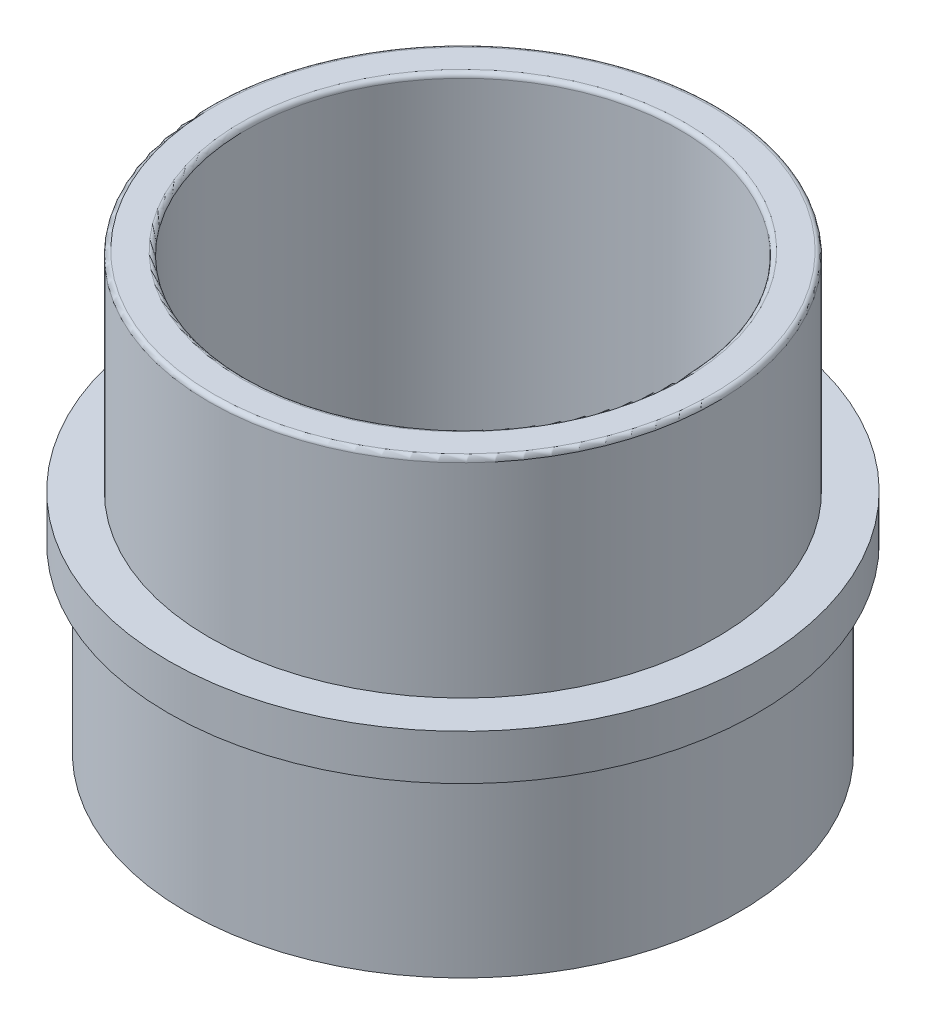
ISO-10303-21;
HEADER;
FILE_DESCRIPTION(('STEP AP214'),'2;1');
FILE_NAME('part.step','',(''),(''),'','','');
FILE_SCHEMA(('AUTOMOTIVE_DESIGN { 1 0 10303 214 1 1 1 1 }'));
ENDSEC;
DATA;
#1=APPLICATION_CONTEXT('core data for automotive mechanical design processes');
#2=APPLICATION_PROTOCOL_DEFINITION('international standard','automotive_design',2000,#1);
#3=PRODUCT_CONTEXT('',#1,'mechanical');
#4=PRODUCT('Part','Part','',(#3));
#5=PRODUCT_RELATED_PRODUCT_CATEGORY('part','',(#4));
#6=PRODUCT_DEFINITION_FORMATION('','',#4);
#7=PRODUCT_DEFINITION_CONTEXT('part definition',#1,'design');
#8=PRODUCT_DEFINITION('design','',#6,#7);
#9=PRODUCT_DEFINITION_SHAPE('','',#8);
#10=(LENGTH_UNIT() NAMED_UNIT(*) SI_UNIT(.MILLI.,.METRE.));
#11=(NAMED_UNIT(*) PLANE_ANGLE_UNIT() SI_UNIT($,.RADIAN.));
#12=(NAMED_UNIT(*) SI_UNIT($,.STERADIAN.) SOLID_ANGLE_UNIT());
#13=UNCERTAINTY_MEASURE_WITH_UNIT(LENGTH_MEASURE(1.E-05),#10,'distance_accuracy_value','');
#14=(GEOMETRIC_REPRESENTATION_CONTEXT(3) GLOBAL_UNCERTAINTY_ASSIGNED_CONTEXT((#13)) GLOBAL_UNIT_ASSIGNED_CONTEXT((#10,
#11,#12)) REPRESENTATION_CONTEXT('',''));
#15=CARTESIAN_POINT('',(0.,0.,0.));
#16=DIRECTION('',(0.,0.,1.));
#17=DIRECTION('',(1.,0.,0.));
#18=AXIS2_PLACEMENT_3D('',#15,#16,#17);
#19=CARTESIAN_POINT('',(0.,5.,0.));
#20=DIRECTION('',(0.,1.,0.));
#21=DIRECTION('',(0.,0.,1.));
#22=AXIS2_PLACEMENT_3D('',#19,#20,#21);
#23=PLANE('',#22);
#24=CARTESIAN_POINT('',(0.,5.,0.));
#25=DIRECTION('',(0.,1.,0.));
#26=DIRECTION('',(0.,0.,1.));
#27=AXIS2_PLACEMENT_3D('',#24,#25,#26);
#28=CIRCLE('',#27,32.5);
#29=CARTESIAN_POINT('',(0.,5.,32.5));
#30=VERTEX_POINT('',#29);
#31=EDGE_CURVE('E62',#30,#30,#28,.T.);
#32=ORIENTED_EDGE('',*,*,#31,.T.);
#33=EDGE_LOOP('',(#32));
#34=FACE_BOUND('',#33,.T.);
#35=CARTESIAN_POINT('',(0.,5.,0.));
#36=DIRECTION('',(0.,1.,0.));
#37=DIRECTION('',(0.,0.,1.));
#38=AXIS2_PLACEMENT_3D('',#35,#36,#37);
#39=CIRCLE('',#38,28.);
#40=CARTESIAN_POINT('',(0.,5.,28.));
#41=VERTEX_POINT('',#40);
#42=EDGE_CURVE('E74',#41,#41,#39,.T.);
#43=ORIENTED_EDGE('',*,*,#42,.F.);
#44=EDGE_LOOP('',(#43));
#45=FACE_BOUND('',#44,.T.);
#46=ADVANCED_FACE('F30',(#34,#45),#23,.T.);
#47=CARTESIAN_POINT('',(0.,-20.,0.));
#48=DIRECTION('',(0.,-1.,0.));
#49=DIRECTION('',(0.,0.,-1.));
#50=AXIS2_PLACEMENT_3D('',#47,#48,#49);
#51=PLANE('',#50);
#52=CARTESIAN_POINT('',(0.,-20.,0.));
#53=DIRECTION('',(0.,-1.,0.));
#54=DIRECTION('',(0.,0.,-1.));
#55=AXIS2_PLACEMENT_3D('',#52,#53,#54);
#56=CIRCLE('',#55,29.3647017494803);
#57=CARTESIAN_POINT('',(0.,-20.,-29.3647017494803));
#58=VERTEX_POINT('',#57);
#59=EDGE_CURVE('E56',#58,#58,#56,.F.);
#60=ORIENTED_EDGE('',*,*,#59,.T.);
#61=EDGE_LOOP('',(#60));
#62=FACE_BOUND('',#61,.T.);
#63=CARTESIAN_POINT('',(0.,-20.,0.));
#64=DIRECTION('',(0.,-1.,0.));
#65=DIRECTION('',(0.,0.,-1.));
#66=AXIS2_PLACEMENT_3D('',#63,#64,#65);
#67=CIRCLE('',#66,30.5);
#68=CARTESIAN_POINT('',(0.,-20.,-30.5));
#69=VERTEX_POINT('',#68);
#70=EDGE_CURVE('E71',#69,#69,#67,.T.);
#71=ORIENTED_EDGE('',*,*,#70,.T.);
#72=EDGE_LOOP('',(#71));
#73=FACE_BOUND('',#72,.T.);
#74=ADVANCED_FACE('F81',(#62,#73),#51,.T.);
#75=CARTESIAN_POINT('',(0.,5.,0.));
#76=DIRECTION('',(0.,-1.,0.));
#77=DIRECTION('',(0.,0.,-1.));
#78=AXIS2_PLACEMENT_3D('',#75,#76,#77);
#79=CYLINDRICAL_SURFACE('',#78,32.5);
#80=ORIENTED_EDGE('',*,*,#31,.F.);
#81=EDGE_LOOP('',(#80));
#82=FACE_BOUND('',#81,.T.);
#83=CARTESIAN_POINT('',(0.,0.,0.));
#84=DIRECTION('',(0.,1.,0.));
#85=DIRECTION('',(0.,0.,1.));
#86=AXIS2_PLACEMENT_3D('',#83,#84,#85);
#87=CIRCLE('',#86,32.5);
#88=CARTESIAN_POINT('',(0.,0.,32.5));
#89=VERTEX_POINT('',#88);
#90=EDGE_CURVE('E63',#89,#89,#87,.T.);
#91=ORIENTED_EDGE('',*,*,#90,.T.);
#92=EDGE_LOOP('',(#91));
#93=FACE_BOUND('',#92,.T.);
#94=ADVANCED_FACE('F87',(#82,#93),#79,.T.);
#95=CARTESIAN_POINT('',(0.,0.,0.));
#96=DIRECTION('',(0.,1.,0.));
#97=DIRECTION('',(0.,0.,1.));
#98=AXIS2_PLACEMENT_3D('',#95,#96,#97);
#99=PLANE('',#98);
#100=CARTESIAN_POINT('',(0.,0.,0.));
#101=DIRECTION('',(0.,1.,0.));
#102=DIRECTION('',(0.,0.,1.));
#103=AXIS2_PLACEMENT_3D('',#100,#101,#102);
#104=CIRCLE('',#103,30.5);
#105=CARTESIAN_POINT('',(0.,0.,30.5));
#106=VERTEX_POINT('',#105);
#107=EDGE_CURVE('E66',#106,#106,#104,.F.);
#108=ORIENTED_EDGE('',*,*,#107,.F.);
#109=EDGE_LOOP('',(#108));
#110=FACE_BOUND('',#109,.T.);
#111=ORIENTED_EDGE('',*,*,#90,.F.);
#112=EDGE_LOOP('',(#111));
#113=FACE_BOUND('',#112,.T.);
#114=ADVANCED_FACE('F93',(#110,#113),#99,.F.);
#115=CARTESIAN_POINT('',(0.,86.2670273047588,0.));
#116=DIRECTION('',(0.,-1.,0.));
#117=DIRECTION('',(0.,0.,-1.));
#118=AXIS2_PLACEMENT_3D('',#115,#116,#117);
#119=CYLINDRICAL_SURFACE('',#118,30.5);
#120=ORIENTED_EDGE('',*,*,#107,.T.);
#121=EDGE_LOOP('',(#120));
#122=FACE_BOUND('',#121,.T.);
#123=ORIENTED_EDGE('',*,*,#70,.F.);
#124=EDGE_LOOP('',(#123));
#125=FACE_BOUND('',#124,.T.);
#126=ADVANCED_FACE('F92',(#122,#125),#119,.T.);
#127=CARTESIAN_POINT('',(0.,-10.,0.));
#128=DIRECTION('',(0.,-1.,0.));
#129=DIRECTION('',(0.,0.,-1.));
#130=AXIS2_PLACEMENT_3D('',#127,#128,#129);
#131=CONICAL_SURFACE('',#130,24.,0.20943951023932);
#132=CARTESIAN_POINT('',(0.,-11.233689466625,0.));
#133=DIRECTION('',(0.,-1.,0.));
#134=DIRECTION('',(0.,0.,-1.));
#135=AXIS2_PLACEMENT_3D('',#132,#133,#134);
#136=CIRCLE('',#135,24.2622287911943);
#137=CARTESIAN_POINT('',(0.,-11.233689466625,-24.2622287911943));
#138=VERTEX_POINT('',#137);
#139=EDGE_CURVE('E50',#138,#138,#136,.F.);
#140=ORIENTED_EDGE('',*,*,#139,.T.);
#141=EDGE_LOOP('',(#140));
#142=FACE_BOUND('',#141,.T.);
#143=CARTESIAN_POINT('',(0.,-16.831646763271,0.));
#144=DIRECTION('',(0.,1.,0.));
#145=DIRECTION('',(0.,0.,1.));
#146=AXIS2_PLACEMENT_3D('',#143,#144,#145);
#147=CIRCLE('',#146,25.452111346545);
#148=CARTESIAN_POINT('',(0.,-16.831646763271,25.452111346545));
#149=VERTEX_POINT('',#148);
#150=EDGE_CURVE('E59',#149,#149,#147,.F.);
#151=ORIENTED_EDGE('',*,*,#150,.T.);
#152=EDGE_LOOP('',(#151));
#153=FACE_BOUND('',#152,.T.);
#154=ADVANCED_FACE('F104',(#142,#153),#131,.F.);
#155=CARTESIAN_POINT('',(0.,-16.,0.));
#156=DIRECTION('',(0.,-1.,0.));
#157=DIRECTION('',(0.,0.,-1.));
#158=AXIS2_PLACEMENT_3D('',#155,#156,#157);
#159=TOROIDAL_SURFACE('',#158,29.3647017494803,4.);
#160=ORIENTED_EDGE('',*,*,#59,.F.);
#161=EDGE_LOOP('',(#160));
#162=FACE_BOUND('',#161,.T.);
#163=ORIENTED_EDGE('',*,*,#150,.F.);
#164=EDGE_LOOP('',(#163));
#165=FACE_BOUND('',#164,.T.);
#166=ADVANCED_FACE('F100',(#162,#165),#159,.T.);
#167=CARTESIAN_POINT('',(0.,5.,0.));
#168=DIRECTION('',(0.,-1.,0.));
#169=DIRECTION('',(0.,0.,-1.));
#170=AXIS2_PLACEMENT_3D('',#167,#168,#169);
#171=CYLINDRICAL_SURFACE('',#170,24.);
#172=CARTESIAN_POINT('',(0.,27.5,0.));
#173=DIRECTION('',(0.,1.,0.));
#174=DIRECTION('',(0.,0.,1.));
#175=AXIS2_PLACEMENT_3D('',#172,#173,#174);
#176=CIRCLE('',#175,24.);
#177=CARTESIAN_POINT('',(0.,27.5,24.));
#178=VERTEX_POINT('',#177);
#179=EDGE_CURVE('E10',#178,#178,#176,.T.);
#180=ORIENTED_EDGE('',*,*,#179,.T.);
#181=EDGE_LOOP('',(#180));
#182=FACE_BOUND('',#181,.T.);
#183=CARTESIAN_POINT('',(0.,-8.73874917681188,0.));
#184=DIRECTION('',(0.,1.,0.));
#185=DIRECTION('',(0.,0.,1.));
#186=AXIS2_PLACEMENT_3D('',#183,#184,#185);
#187=CIRCLE('',#186,24.);
#188=CARTESIAN_POINT('',(0.,-8.73874917681188,24.));
#189=VERTEX_POINT('',#188);
#190=EDGE_CURVE('E53',#189,#189,#187,.F.);
#191=ORIENTED_EDGE('',*,*,#190,.T.);
#192=EDGE_LOOP('',(#191));
#193=FACE_BOUND('',#192,.T.);
#194=ADVANCED_FACE('F103',(#182,#193),#171,.F.);
#195=CARTESIAN_POINT('',(0.,-8.73874917681188,0.));
#196=DIRECTION('',(0.,1.,0.));
#197=DIRECTION('',(0.,0.,1.));
#198=AXIS2_PLACEMENT_3D('',#195,#196,#197);
#199=TOROIDAL_SURFACE('',#198,36.,12.);
#200=ORIENTED_EDGE('',*,*,#139,.F.);
#201=EDGE_LOOP('',(#200));
#202=FACE_BOUND('',#201,.T.);
#203=ORIENTED_EDGE('',*,*,#190,.F.);
#204=EDGE_LOOP('',(#203));
#205=FACE_BOUND('',#204,.T.);
#206=ADVANCED_FACE('F106',(#202,#205),#199,.T.);
#207=CARTESIAN_POINT('',(0.,28.,0.));
#208=DIRECTION('',(0.,1.,0.));
#209=DIRECTION('',(0.,0.,1.));
#210=AXIS2_PLACEMENT_3D('',#207,#208,#209);
#211=PLANE('',#210);
#212=CARTESIAN_POINT('',(0.,28.,0.));
#213=DIRECTION('',(0.,1.,0.));
#214=DIRECTION('',(0.,0.,1.));
#215=AXIS2_PLACEMENT_3D('',#212,#213,#214);
#216=CIRCLE('',#215,27.5);
#217=CARTESIAN_POINT('',(0.,28.,27.5));
#218=VERTEX_POINT('',#217);
#219=EDGE_CURVE('E41',#218,#218,#216,.T.);
#220=ORIENTED_EDGE('',*,*,#219,.T.);
#221=EDGE_LOOP('',(#220));
#222=FACE_BOUND('',#221,.T.);
#223=CARTESIAN_POINT('',(0.,28.,0.));
#224=DIRECTION('',(0.,1.,0.));
#225=DIRECTION('',(0.,0.,1.));
#226=AXIS2_PLACEMENT_3D('',#223,#224,#225);
#227=CIRCLE('',#226,24.5);
#228=CARTESIAN_POINT('',(0.,28.,24.5));
#229=VERTEX_POINT('',#228);
#230=EDGE_CURVE('E45',#229,#229,#227,.F.);
#231=ORIENTED_EDGE('',*,*,#230,.T.);
#232=EDGE_LOOP('',(#231));
#233=FACE_BOUND('',#232,.T.);
#234=ADVANCED_FACE('F108',(#222,#233),#211,.T.);
#235=CARTESIAN_POINT('',(0.,28.,0.));
#236=DIRECTION('',(0.,-1.,0.));
#237=DIRECTION('',(0.,0.,-1.));
#238=AXIS2_PLACEMENT_3D('',#235,#236,#237);
#239=CYLINDRICAL_SURFACE('',#238,28.);
#240=CARTESIAN_POINT('',(0.,27.5,0.));
#241=DIRECTION('',(0.,1.,0.));
#242=DIRECTION('',(0.,0.,1.));
#243=AXIS2_PLACEMENT_3D('',#240,#241,#242);
#244=CIRCLE('',#243,28.);
#245=CARTESIAN_POINT('',(0.,27.5,28.));
#246=VERTEX_POINT('',#245);
#247=EDGE_CURVE('E37',#246,#246,#244,.F.);
#248=ORIENTED_EDGE('',*,*,#247,.T.);
#249=EDGE_LOOP('',(#248));
#250=FACE_BOUND('',#249,.T.);
#251=ORIENTED_EDGE('',*,*,#42,.T.);
#252=EDGE_LOOP('',(#251));
#253=FACE_BOUND('',#252,.T.);
#254=ADVANCED_FACE('F78',(#250,#253),#239,.T.);
#255=CARTESIAN_POINT('',(0.,27.5,0.));
#256=DIRECTION('',(0.,1.,0.));
#257=DIRECTION('',(0.,0.,1.));
#258=AXIS2_PLACEMENT_3D('',#255,#256,#257);
#259=TOROIDAL_SURFACE('',#258,27.5,0.5);
#260=ORIENTED_EDGE('',*,*,#247,.F.);
#261=EDGE_LOOP('',(#260));
#262=FACE_BOUND('',#261,.T.);
#263=ORIENTED_EDGE('',*,*,#219,.F.);
#264=EDGE_LOOP('',(#263));
#265=FACE_BOUND('',#264,.T.);
#266=ADVANCED_FACE('F110',(#262,#265),#259,.T.);
#267=CARTESIAN_POINT('',(0.,27.5,0.));
#268=DIRECTION('',(0.,1.,0.));
#269=DIRECTION('',(0.,0.,1.));
#270=AXIS2_PLACEMENT_3D('',#267,#268,#269);
#271=TOROIDAL_SURFACE('',#270,24.5,0.5);
#272=ORIENTED_EDGE('',*,*,#230,.F.);
#273=EDGE_LOOP('',(#272));
#274=FACE_BOUND('',#273,.T.);
#275=ORIENTED_EDGE('',*,*,#179,.F.);
#276=EDGE_LOOP('',(#275));
#277=FACE_BOUND('',#276,.T.);
#278=ADVANCED_FACE('F32',(#274,#277),#271,.T.);
#279=CLOSED_SHELL('',(#46,#74,#94,#114,#126,#154,#166,#194,#206,#234,#254,#266,#278));
#280=MANIFOLD_SOLID_BREP('B2',#279);
#281=ADVANCED_BREP_SHAPE_REPRESENTATION('',(#18,#280),#14);
#282=SHAPE_DEFINITION_REPRESENTATION(#9,#281);
ENDSEC;
END-ISO-10303-21;
